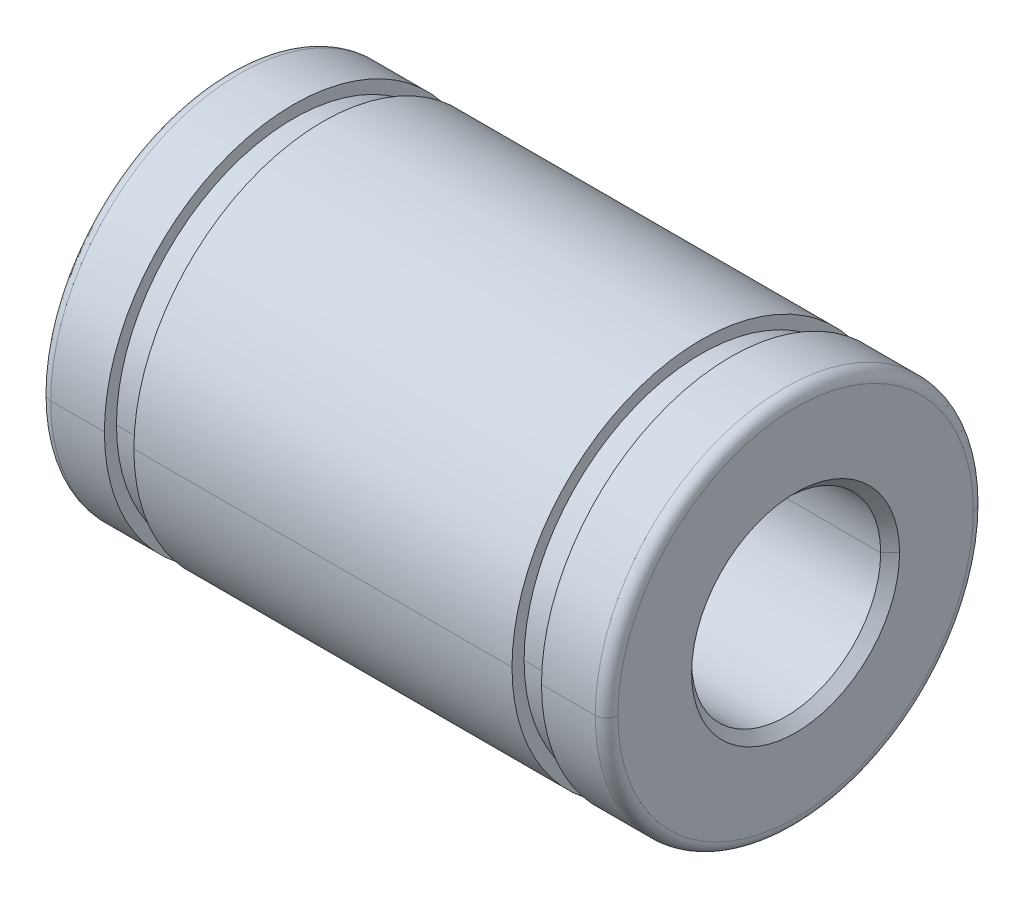
ISO-10303-21;
HEADER;
FILE_DESCRIPTION(('STEP AP214'),'2;1');
FILE_NAME('part.step','',(''),(''),'','','');
FILE_SCHEMA(('AUTOMOTIVE_DESIGN { 1 0 10303 214 1 1 1 1 }'));
ENDSEC;
DATA;
#1=APPLICATION_CONTEXT('core data for automotive mechanical design processes');
#2=APPLICATION_PROTOCOL_DEFINITION('international standard','automotive_design',2000,#1);
#3=PRODUCT_CONTEXT('',#1,'mechanical');
#4=PRODUCT('Part','Part','',(#3));
#5=PRODUCT_RELATED_PRODUCT_CATEGORY('part','',(#4));
#6=PRODUCT_DEFINITION_FORMATION('','',#4);
#7=PRODUCT_DEFINITION_CONTEXT('part definition',#1,'design');
#8=PRODUCT_DEFINITION('design','',#6,#7);
#9=PRODUCT_DEFINITION_SHAPE('','',#8);
#10=(LENGTH_UNIT() NAMED_UNIT(*) SI_UNIT(.MILLI.,.METRE.));
#11=(NAMED_UNIT(*) PLANE_ANGLE_UNIT() SI_UNIT($,.RADIAN.));
#12=(NAMED_UNIT(*) SI_UNIT($,.STERADIAN.) SOLID_ANGLE_UNIT());
#13=UNCERTAINTY_MEASURE_WITH_UNIT(LENGTH_MEASURE(1.E-05),#10,'distance_accuracy_value','');
#14=(GEOMETRIC_REPRESENTATION_CONTEXT(3) GLOBAL_UNCERTAINTY_ASSIGNED_CONTEXT((#13)) GLOBAL_UNIT_ASSIGNED_CONTEXT((#10,
#11,#12)) REPRESENTATION_CONTEXT('',''));
#15=CARTESIAN_POINT('',(0.,0.,0.));
#16=DIRECTION('',(0.,0.,1.));
#17=DIRECTION('',(1.,0.,0.));
#18=AXIS2_PLACEMENT_3D('',#15,#16,#17);
#19=CARTESIAN_POINT('',(0.,5.969,0.));
#20=DIRECTION('',(-1.,0.,0.));
#21=DIRECTION('',(0.,0.,1.));
#22=AXIS2_PLACEMENT_3D('',#19,#20,#21);
#23=PLANE('',#22);
#24=CARTESIAN_POINT('',(0.,0.,0.));
#25=DIRECTION('',(1.,0.,0.));
#26=DIRECTION('',(0.,0.,-1.));
#27=AXIS2_PLACEMENT_3D('',#24,#25,#26);
#28=CIRCLE('',#27,3.4925);
#29=CARTESIAN_POINT('',(0.,0.,-3.4925));
#30=VERTEX_POINT('',#29);
#31=CARTESIAN_POINT('',(0.,0.,3.4925));
#32=VERTEX_POINT('',#31);
#33=EDGE_CURVE('E11',#30,#32,#28,.T.);
#34=ORIENTED_EDGE('',*,*,#33,.T.);
#35=CARTESIAN_POINT('',(0.,0.,0.));
#36=DIRECTION('',(1.,0.,0.));
#37=DIRECTION('',(0.,0.,-1.));
#38=AXIS2_PLACEMENT_3D('',#35,#36,#37);
#39=CIRCLE('',#38,3.4925);
#40=EDGE_CURVE('E25',#32,#30,#39,.T.);
#41=ORIENTED_EDGE('',*,*,#40,.T.);
#42=EDGE_LOOP('',(#34,#41));
#43=FACE_BOUND('',#42,.T.);
#44=CARTESIAN_POINT('',(0.,0.,0.));
#45=DIRECTION('',(1.,0.,0.));
#46=DIRECTION('',(0.,0.,-1.));
#47=AXIS2_PLACEMENT_3D('',#44,#45,#46);
#48=CIRCLE('',#47,5.969);
#49=CARTESIAN_POINT('',(0.,0.,-5.969));
#50=VERTEX_POINT('',#49);
#51=CARTESIAN_POINT('',(0.,0.,5.969));
#52=VERTEX_POINT('',#51);
#53=EDGE_CURVE('E468',#50,#52,#48,.T.);
#54=ORIENTED_EDGE('',*,*,#53,.F.);
#55=CARTESIAN_POINT('',(0.,0.,0.));
#56=DIRECTION('',(1.,0.,0.));
#57=DIRECTION('',(0.,0.,-1.));
#58=AXIS2_PLACEMENT_3D('',#55,#56,#57);
#59=CIRCLE('',#58,5.969);
#60=EDGE_CURVE('E466',#52,#50,#59,.T.);
#61=ORIENTED_EDGE('',*,*,#60,.F.);
#62=EDGE_LOOP('',(#54,#61));
#63=FACE_BOUND('',#62,.T.);
#64=ADVANCED_FACE('F17',(#43,#63),#23,.T.);
#65=CARTESIAN_POINT('',(0.380999999999964,0.,0.));
#66=DIRECTION('',(1.,0.,0.));
#67=DIRECTION('',(0.,1.,0.));
#68=AXIS2_PLACEMENT_3D('',#65,#66,#67);
#69=TOROIDAL_SURFACE('',#68,5.969,0.381);
#70=ORIENTED_EDGE('',*,*,#60,.T.);
#71=CARTESIAN_POINT('',(0.,0.,-5.969));
#72=CARTESIAN_POINT('',(-1.32240858758698E-07,0.,-5.9752341042174));
#73=CARTESIAN_POINT('',(0.000153003075281332,0.,-5.9814681971824));
#74=CARTESIAN_POINT('',(0.000764859296306252,0.,-5.99392137065509));
#75=CARTESIAN_POINT('',(0.0012235802011911,0.,-6.00014045116278));
#76=CARTESIAN_POINT('',(0.00244565807452358,0.,-6.01254860976834));
#77=CARTESIAN_POINT('',(0.00320901504297122,0.,-6.01873768786621));
#78=CARTESIAN_POINT('',(0.00503848436379427,0.,-6.03107093366877));
#79=CARTESIAN_POINT('',(0.00610459671616969,0.,-6.03721510137347));
#80=CARTESIAN_POINT('',(0.00853701961649716,0.,-6.04944372400281));
#81=CARTESIAN_POINT('',(0.0099033301644492,0.,-6.05552817892745));
#82=CARTESIAN_POINT('',(0.0129328549012367,0.,-6.06762271815884));
#83=CARTESIAN_POINT('',(0.0145960690900722,0.,-6.07363280246559));
#84=CARTESIAN_POINT('',(0.0182153950819128,0.,-6.08556412160231));
#85=CARTESIAN_POINT('',(0.0201715068849179,0.,-6.09148535643227));
#86=CARTESIAN_POINT('',(0.0243719154455482,0.,-6.1032247118526));
#87=CARTESIAN_POINT('',(0.0266162122031733,0.,-6.10904283244298));
#88=CARTESIAN_POINT('',(0.0313875840231542,0.,-6.12056194301922));
#89=CARTESIAN_POINT('',(0.0339146590855101,0.,-6.12626293300507));
#90=CARTESIAN_POINT('',(0.0392454995543539,0.,-6.1375340481888));
#91=CARTESIAN_POINT('',(0.0420492649608419,0.,-6.14310417338667));
#92=CARTESIAN_POINT('',(0.0479267316056391,0.,-6.15410014007474));
#93=CARTESIAN_POINT('',(0.0510004328439482,0.,-6.15952598156493));
#94=CARTESIAN_POINT('',(0.0574103663357721,0.,-6.1702203095103));
#95=CARTESIAN_POINT('',(0.0607465985892869,0.,-6.17548879596548));
#96=CARTESIAN_POINT('',(0.067673556836101,0.,-6.18585572159546));
#97=CARTESIAN_POINT('',(0.0712642828294003,0.,-6.19095416077026));
#98=CARTESIAN_POINT('',(0.0786915781822755,0.,-6.20096870925297));
#99=CARTESIAN_POINT('',(0.0825281475418514,0.,-6.20588481856086));
#100=CARTESIAN_POINT('',(0.0904378869956701,0.,-6.21552286397183));
#101=CARTESIAN_POINT('',(0.0945110570899129,0.,-6.2202448000749));
#102=CARTESIAN_POINT('',(0.102884185389535,0.,-6.22948312351853));
#103=CARTESIAN_POINT('',(0.107184143594915,0.,-6.2339995108591));
#104=CARTESIAN_POINT('',(0.116000489140863,0.,-6.24281585640505));
#105=CARTESIAN_POINT('',(0.120516876481432,0.,-6.24711581461043));
#106=CARTESIAN_POINT('',(0.129755199925067,0.,-6.25548894291005));
#107=CARTESIAN_POINT('',(0.134477136028132,0.,-6.25956211300429));
#108=CARTESIAN_POINT('',(0.144115181439096,0.,-6.26747185245811));
#109=CARTESIAN_POINT('',(0.149031290746994,0.,-6.27130842181769));
#110=CARTESIAN_POINT('',(0.159045839229698,0.,-6.27873571717056));
#111=CARTESIAN_POINT('',(0.164144278404504,0.,-6.28232644316386));
#112=CARTESIAN_POINT('',(0.174511204034485,0.,-6.28925340141068));
#113=CARTESIAN_POINT('',(0.179779690489661,0.,-6.29258963366419));
#114=CARTESIAN_POINT('',(0.190474018435031,0.,-6.29899956715601));
#115=CARTESIAN_POINT('',(0.195899859925225,0.,-6.30207326839432));
#116=CARTESIAN_POINT('',(0.206895826613291,0.,-6.30795073503912));
#117=CARTESIAN_POINT('',(0.212465951811162,0.,-6.31075450044561));
#118=CARTESIAN_POINT('',(0.22373706699489,0.,-6.31608534091445));
#119=CARTESIAN_POINT('',(0.229438056980747,0.,-6.31861241597681));
#120=CARTESIAN_POINT('',(0.240957167556981,0.,-6.32338378779679));
#121=CARTESIAN_POINT('',(0.246775288147358,0.,-6.32562808455441));
#122=CARTESIAN_POINT('',(0.258514643567696,0.,-6.32982849311505));
#123=CARTESIAN_POINT('',(0.264435878397656,0.,-6.33178460491805));
#124=CARTESIAN_POINT('',(0.27636719753437,0.,-6.33540393090989));
#125=CARTESIAN_POINT('',(0.282377281841124,0.,-6.33706714509873));
#126=CARTESIAN_POINT('',(0.294471821072514,0.,-6.34009666983551));
#127=CARTESIAN_POINT('',(0.30055627599715,0.,-6.34146298038347));
#128=CARTESIAN_POINT('',(0.312784898626486,0.,-6.34389540328379));
#129=CARTESIAN_POINT('',(0.318929066331186,0.,-6.34496151563617));
#130=CARTESIAN_POINT('',(0.331262312133754,0.,-6.34679098495699));
#131=CARTESIAN_POINT('',(0.337451390231621,0.,-6.34755434192544));
#132=CARTESIAN_POINT('',(0.349859548837179,0.,-6.34877641979877));
#133=CARTESIAN_POINT('',(0.35607862934487,0.,-6.34923514070366));
#134=CARTESIAN_POINT('',(0.368531802817563,0.,-6.34984699692468));
#135=CARTESIAN_POINT('',(0.374765895782564,0.,-6.35000013224082));
#136=CARTESIAN_POINT('',(0.380999999999963,0.,-6.35));
#137=B_SPLINE_CURVE_WITH_KNOTS('',3,(#71,#72,#73,#74,#75,#76,#77,#78,#79,#80,#81,#82,#83,#84,
#85,#86,#87,#88,#89,#90,#91,#92,#93,#94,#95,#96,#97,#98,#99,#100,#101,#102,#103,#104,#105,#106,
#107,#108,#109,#110,#111,#112,#113,#114,#115,#116,#117,#118,#119,#120,#121,#122,#123,#124,#125,
#126,#127,#128,#129,#130,#131,#132,#133,#134,#135,#136),.UNSPECIFIED.,.F.,.F.,(4,2,2,2,2,2,2,2,
2,2,2,2,2,2,2,2,2,2,2,2,2,2,2,2,2,2,2,2,2,2,2,2,4),(0.,0.0187004161344584,0.0374008322689178,
0.056101248403377,0.0748016645378364,0.0935020806722951,0.112202496806755,0.130902912941214,
0.149603329075673,0.168303745210132,0.187004161344591,0.20570457747905,0.224404993613509,
0.243105409747968,0.261805825882428,0.280506242016887,0.299206658151346,0.317907074285805,
0.336607490420264,0.355307906554723,0.374008322689182,0.392708738823642,0.411409154958101,
0.43010957109256,0.448809987227019,0.467510403361478,0.486210819495937,0.504911235630396,
0.523611651764855,0.542312067899315,0.561012484033774,0.579712900168233,0.598413316302692),.UNSPECIFIED.);
#138=CARTESIAN_POINT('',(0.381,0.,-6.35));
#139=VERTEX_POINT('',#138);
#140=EDGE_CURVE('E434',#50,#139,#137,.T.);
#141=ORIENTED_EDGE('',*,*,#140,.T.);
#142=CARTESIAN_POINT('',(0.381,0.,0.));
#143=DIRECTION('',(1.,0.,0.));
#144=DIRECTION('',(0.,0.,-1.));
#145=AXIS2_PLACEMENT_3D('',#142,#143,#144);
#146=CIRCLE('',#145,6.35);
#147=CARTESIAN_POINT('',(0.381,0.,6.35));
#148=VERTEX_POINT('',#147);
#149=EDGE_CURVE('E452',#148,#139,#146,.T.);
#150=ORIENTED_EDGE('',*,*,#149,.F.);
#151=CARTESIAN_POINT('',(0.,0.,5.969));
#152=CARTESIAN_POINT('',(-1.32240858775832E-07,0.,5.9752341042174));
#153=CARTESIAN_POINT('',(0.000153003075281312,0.,5.9814681971824));
#154=CARTESIAN_POINT('',(0.000764859296306258,0.,5.99392137065509));
#155=CARTESIAN_POINT('',(0.00122358020119112,0.,6.00014045116278));
#156=CARTESIAN_POINT('',(0.00244565807452364,0.,6.01254860976834));
#157=CARTESIAN_POINT('',(0.00320901504297128,0.,6.01873768786621));
#158=CARTESIAN_POINT('',(0.00503848436379435,0.,6.03107093366877));
#159=CARTESIAN_POINT('',(0.00610459671616979,0.,6.03721510137347));
#160=CARTESIAN_POINT('',(0.00853701961649722,0.,6.04944372400281));
#161=CARTESIAN_POINT('',(0.00990333016444922,0.,6.05552817892745));
#162=CARTESIAN_POINT('',(0.0129328549012367,0.,6.06762271815884));
#163=CARTESIAN_POINT('',(0.0145960690900723,0.,6.07363280246559));
#164=CARTESIAN_POINT('',(0.018215395081913,0.,6.08556412160231));
#165=CARTESIAN_POINT('',(0.0201715068849182,0.,6.09148535643227));
#166=CARTESIAN_POINT('',(0.0243719154455484,0.,6.1032247118526));
#167=CARTESIAN_POINT('',(0.0266162122031734,0.,6.10904283244298));
#168=CARTESIAN_POINT('',(0.0313875840231543,0.,6.12056194301922));
#169=CARTESIAN_POINT('',(0.0339146590855102,0.,6.12626293300507));
#170=CARTESIAN_POINT('',(0.0392454995543542,0.,6.1375340481888));
#171=CARTESIAN_POINT('',(0.0420492649608423,0.,6.14310417338667));
#172=CARTESIAN_POINT('',(0.0479267316056393,0.,6.15410014007474));
#173=CARTESIAN_POINT('',(0.0510004328439482,0.,6.15952598156493));
#174=CARTESIAN_POINT('',(0.0574103663357722,0.,6.1702203095103));
#175=CARTESIAN_POINT('',(0.0607465985892872,0.,6.17548879596548));
#176=CARTESIAN_POINT('',(0.0676735568361013,0.,6.18585572159546));
#177=CARTESIAN_POINT('',(0.0712642828294004,0.,6.19095416077026));
#178=CARTESIAN_POINT('',(0.0786915781822755,0.,6.20096870925297));
#179=CARTESIAN_POINT('',(0.0825281475418516,0.,6.20588481856087));
#180=CARTESIAN_POINT('',(0.0904378869956704,0.,6.21552286397183));
#181=CARTESIAN_POINT('',(0.0945110570899132,0.,6.2202448000749));
#182=CARTESIAN_POINT('',(0.102884185389535,0.,6.22948312351853));
#183=CARTESIAN_POINT('',(0.107184143594915,0.,6.2339995108591));
#184=CARTESIAN_POINT('',(0.116000489140863,0.,6.24281585640505));
#185=CARTESIAN_POINT('',(0.120516876481432,0.,6.24711581461043));
#186=CARTESIAN_POINT('',(0.129755199925067,0.,6.25548894291005));
#187=CARTESIAN_POINT('',(0.134477136028133,0.,6.25956211300429));
#188=CARTESIAN_POINT('',(0.144115181439096,0.,6.26747185245811));
#189=CARTESIAN_POINT('',(0.149031290746994,0.,6.27130842181769));
#190=CARTESIAN_POINT('',(0.159045839229698,0.,6.27873571717056));
#191=CARTESIAN_POINT('',(0.164144278404504,0.,6.28232644316386));
#192=CARTESIAN_POINT('',(0.174511204034486,0.,6.28925340141068));
#193=CARTESIAN_POINT('',(0.179779690489661,0.,6.29258963366419));
#194=CARTESIAN_POINT('',(0.190474018435031,0.,6.29899956715601));
#195=CARTESIAN_POINT('',(0.195899859925226,0.,6.30207326839432));
#196=CARTESIAN_POINT('',(0.206895826613291,0.,6.30795073503912));
#197=CARTESIAN_POINT('',(0.212465951811162,0.,6.31075450044561));
#198=CARTESIAN_POINT('',(0.22373706699489,0.,6.31608534091445));
#199=CARTESIAN_POINT('',(0.229438056980747,0.,6.31861241597681));
#200=CARTESIAN_POINT('',(0.240957167556981,0.,6.32338378779679));
#201=CARTESIAN_POINT('',(0.246775288147359,0.,6.32562808455441));
#202=CARTESIAN_POINT('',(0.258514643567696,0.,6.32982849311505));
#203=CARTESIAN_POINT('',(0.264435878397656,0.,6.33178460491805));
#204=CARTESIAN_POINT('',(0.27636719753437,0.,6.33540393090989));
#205=CARTESIAN_POINT('',(0.282377281841125,0.,6.33706714509873));
#206=CARTESIAN_POINT('',(0.294471821072515,0.,6.34009666983551));
#207=CARTESIAN_POINT('',(0.30055627599715,0.,6.34146298038347));
#208=CARTESIAN_POINT('',(0.312784898626486,0.,6.34389540328379));
#209=CARTESIAN_POINT('',(0.318929066331186,0.,6.34496151563617));
#210=CARTESIAN_POINT('',(0.331262312133754,0.,6.34679098495699));
#211=CARTESIAN_POINT('',(0.337451390231621,0.,6.34755434192544));
#212=CARTESIAN_POINT('',(0.34985954883718,0.,6.34877641979877));
#213=CARTESIAN_POINT('',(0.356078629344871,0.,6.34923514070366));
#214=CARTESIAN_POINT('',(0.368531802817563,0.,6.34984699692468));
#215=CARTESIAN_POINT('',(0.374765895782564,0.,6.35000013224082));
#216=CARTESIAN_POINT('',(0.380999999999963,0.,6.35));
#217=B_SPLINE_CURVE_WITH_KNOTS('',3,(#151,#152,#153,#154,#155,#156,#157,#158,#159,#160,#161,
#162,#163,#164,#165,#166,#167,#168,#169,#170,#171,#172,#173,#174,#175,#176,#177,#178,#179,#180,
#181,#182,#183,#184,#185,#186,#187,#188,#189,#190,#191,#192,#193,#194,#195,#196,#197,#198,#199,
#200,#201,#202,#203,#204,#205,#206,#207,#208,#209,#210,#211,#212,#213,#214,#215,#216),
.UNSPECIFIED.,.F.,.F.,(4,2,2,2,2,2,2,2,2,2,2,2,2,2,2,2,2,2,2,2,2,2,2,2,2,2,2,2,2,2,2,2,4),(0.,
0.0187004161344593,0.0374008322689186,0.056101248403377,0.0748016645378364,0.093502080672296,
0.112202496806755,0.130902912941214,0.149603329075673,0.168303745210132,0.187004161344591,
0.205704577479051,0.224404993613509,0.243105409747969,0.261805825882428,0.280506242016887,
0.299206658151346,0.317907074285805,0.336607490420264,0.355307906554724,0.374008322689183,
0.392708738823642,0.411409154958101,0.43010957109256,0.448809987227019,0.467510403361479,
0.486210819495938,0.504911235630397,0.523611651764856,0.542312067899315,0.561012484033774,
0.579712900168233,0.598413316302692),.UNSPECIFIED.);
#218=EDGE_CURVE('E437',#52,#148,#217,.T.);
#219=ORIENTED_EDGE('',*,*,#218,.F.);
#220=EDGE_LOOP('',(#70,#141,#150,#219));
#221=FACE_BOUND('',#220,.T.);
#222=ADVANCED_FACE('F417',(#221),#69,.T.);
#223=CARTESIAN_POINT('',(0.380999999999964,0.,0.));
#224=DIRECTION('',(1.,0.,0.));
#225=DIRECTION('',(0.,-1.,0.));
#226=AXIS2_PLACEMENT_3D('',#223,#224,#225);
#227=TOROIDAL_SURFACE('',#226,5.969,0.381);
#228=CARTESIAN_POINT('',(0.381,0.,0.));
#229=DIRECTION('',(1.,0.,0.));
#230=DIRECTION('',(0.,0.,-1.));
#231=AXIS2_PLACEMENT_3D('',#228,#229,#230);
#232=CIRCLE('',#231,6.35);
#233=EDGE_CURVE('E398',#139,#148,#232,.T.);
#234=ORIENTED_EDGE('',*,*,#233,.F.);
#235=ORIENTED_EDGE('',*,*,#140,.F.);
#236=ORIENTED_EDGE('',*,*,#53,.T.);
#237=ORIENTED_EDGE('',*,*,#218,.T.);
#238=EDGE_LOOP('',(#234,#235,#236,#237));
#239=FACE_BOUND('',#238,.T.);
#240=ADVANCED_FACE('F407',(#239),#227,.T.);
#241=CARTESIAN_POINT('',(19.05,0.,0.));
#242=DIRECTION('',(-1.,0.,0.));
#243=DIRECTION('',(0.,-1.,0.));
#244=AXIS2_PLACEMENT_3D('',#241,#242,#243);
#245=CYLINDRICAL_SURFACE('',#244,6.35);
#246=CARTESIAN_POINT('',(2.1844,0.,0.));
#247=DIRECTION('',(1.,0.,0.));
#248=DIRECTION('',(0.,0.,-1.));
#249=AXIS2_PLACEMENT_3D('',#246,#247,#248);
#250=CIRCLE('',#249,6.35);
#251=CARTESIAN_POINT('',(2.1844,0.,-6.35));
#252=VERTEX_POINT('',#251);
#253=CARTESIAN_POINT('',(2.1844,0.,6.35));
#254=VERTEX_POINT('',#253);
#255=EDGE_CURVE('E393',#252,#254,#250,.T.);
#256=ORIENTED_EDGE('',*,*,#255,.F.);
#257=DIRECTION('',(-1.,0.,0.));
#258=VECTOR('',#257,1.);
#259=CARTESIAN_POINT('',(2.1844,0.,-6.35));
#260=LINE('',#259,#258);
#261=EDGE_CURVE('E388',#252,#139,#260,.T.);
#262=ORIENTED_EDGE('',*,*,#261,.T.);
#263=ORIENTED_EDGE('',*,*,#233,.T.);
#264=DIRECTION('',(-1.,0.,0.));
#265=VECTOR('',#264,1.);
#266=CARTESIAN_POINT('',(2.1844,0.,6.35));
#267=LINE('',#266,#265);
#268=EDGE_CURVE('E383',#254,#148,#267,.T.);
#269=ORIENTED_EDGE('',*,*,#268,.F.);
#270=EDGE_LOOP('',(#256,#262,#263,#269));
#271=FACE_BOUND('',#270,.T.);
#272=ADVANCED_FACE('F416',(#271),#245,.T.);
#273=CARTESIAN_POINT('',(19.05,0.,0.));
#274=DIRECTION('',(-1.,0.,0.));
#275=DIRECTION('',(0.,1.,0.));
#276=AXIS2_PLACEMENT_3D('',#273,#274,#275);
#277=CYLINDRICAL_SURFACE('',#276,6.35);
#278=ORIENTED_EDGE('',*,*,#149,.T.);
#279=ORIENTED_EDGE('',*,*,#261,.F.);
#280=CARTESIAN_POINT('',(2.1844,0.,0.));
#281=DIRECTION('',(1.,0.,0.));
#282=DIRECTION('',(0.,0.,-1.));
#283=AXIS2_PLACEMENT_3D('',#280,#281,#282);
#284=CIRCLE('',#283,6.35);
#285=EDGE_CURVE('E378',#254,#252,#284,.T.);
#286=ORIENTED_EDGE('',*,*,#285,.F.);
#287=ORIENTED_EDGE('',*,*,#268,.T.);
#288=EDGE_LOOP('',(#278,#279,#286,#287));
#289=FACE_BOUND('',#288,.T.);
#290=ADVANCED_FACE('F507',(#289),#277,.T.);
#291=CARTESIAN_POINT('',(2.1844,5.9436,0.));
#292=DIRECTION('',(1.,0.,0.));
#293=DIRECTION('',(0.,0.,-1.));
#294=AXIS2_PLACEMENT_3D('',#291,#292,#293);
#295=PLANE('',#294);
#296=ORIENTED_EDGE('',*,*,#255,.T.);
#297=ORIENTED_EDGE('',*,*,#285,.T.);
#298=EDGE_LOOP('',(#296,#297));
#299=FACE_BOUND('',#298,.T.);
#300=CARTESIAN_POINT('',(2.1844,0.,0.));
#301=DIRECTION('',(1.,0.,0.));
#302=DIRECTION('',(0.,0.,-1.));
#303=AXIS2_PLACEMENT_3D('',#300,#301,#302);
#304=CIRCLE('',#303,5.9436);
#305=CARTESIAN_POINT('',(2.1844,0.,-5.9436));
#306=VERTEX_POINT('',#305);
#307=CARTESIAN_POINT('',(2.1844,0.,5.9436));
#308=VERTEX_POINT('',#307);
#309=EDGE_CURVE('E373',#306,#308,#304,.T.);
#310=ORIENTED_EDGE('',*,*,#309,.F.);
#311=CARTESIAN_POINT('',(2.1844,0.,0.));
#312=DIRECTION('',(1.,0.,0.));
#313=DIRECTION('',(0.,0.,-1.));
#314=AXIS2_PLACEMENT_3D('',#311,#312,#313);
#315=CIRCLE('',#314,5.9436);
#316=EDGE_CURVE('E368',#308,#306,#315,.T.);
#317=ORIENTED_EDGE('',*,*,#316,.F.);
#318=EDGE_LOOP('',(#310,#317));
#319=FACE_BOUND('',#318,.T.);
#320=ADVANCED_FACE('F516',(#299,#319),#295,.T.);
#321=CARTESIAN_POINT('',(19.05,0.,0.));
#322=DIRECTION('',(-1.,0.,0.));
#323=DIRECTION('',(0.,1.,0.));
#324=AXIS2_PLACEMENT_3D('',#321,#322,#323);
#325=CYLINDRICAL_SURFACE('',#324,5.9436);
#326=ORIENTED_EDGE('',*,*,#316,.T.);
#327=DIRECTION('',(-1.,0.,0.));
#328=VECTOR('',#327,1.);
#329=CARTESIAN_POINT('',(3.175,0.,-5.9436));
#330=LINE('',#329,#328);
#331=CARTESIAN_POINT('',(3.175,0.,-5.9436));
#332=VERTEX_POINT('',#331);
#333=EDGE_CURVE('E363',#332,#306,#330,.T.);
#334=ORIENTED_EDGE('',*,*,#333,.F.);
#335=CARTESIAN_POINT('',(3.175,0.,0.));
#336=DIRECTION('',(1.,0.,0.));
#337=DIRECTION('',(0.,0.,-1.));
#338=AXIS2_PLACEMENT_3D('',#335,#336,#337);
#339=CIRCLE('',#338,5.9436);
#340=CARTESIAN_POINT('',(3.175,0.,5.9436));
#341=VERTEX_POINT('',#340);
#342=EDGE_CURVE('E358',#341,#332,#339,.T.);
#343=ORIENTED_EDGE('',*,*,#342,.F.);
#344=DIRECTION('',(-1.,0.,0.));
#345=VECTOR('',#344,1.);
#346=CARTESIAN_POINT('',(3.175,0.,5.9436));
#347=LINE('',#346,#345);
#348=EDGE_CURVE('E353',#341,#308,#347,.T.);
#349=ORIENTED_EDGE('',*,*,#348,.T.);
#350=EDGE_LOOP('',(#326,#334,#343,#349));
#351=FACE_BOUND('',#350,.T.);
#352=ADVANCED_FACE('F525',(#351),#325,.T.);
#353=CARTESIAN_POINT('',(19.05,0.,0.));
#354=DIRECTION('',(-1.,0.,0.));
#355=DIRECTION('',(0.,-1.,0.));
#356=AXIS2_PLACEMENT_3D('',#353,#354,#355);
#357=CYLINDRICAL_SURFACE('',#356,5.9436);
#358=CARTESIAN_POINT('',(3.175,0.,0.));
#359=DIRECTION('',(1.,0.,0.));
#360=DIRECTION('',(0.,0.,-1.));
#361=AXIS2_PLACEMENT_3D('',#358,#359,#360);
#362=CIRCLE('',#361,5.9436);
#363=EDGE_CURVE('E348',#332,#341,#362,.T.);
#364=ORIENTED_EDGE('',*,*,#363,.F.);
#365=ORIENTED_EDGE('',*,*,#333,.T.);
#366=ORIENTED_EDGE('',*,*,#309,.T.);
#367=ORIENTED_EDGE('',*,*,#348,.F.);
#368=EDGE_LOOP('',(#364,#365,#366,#367));
#369=FACE_BOUND('',#368,.T.);
#370=ADVANCED_FACE('F535',(#369),#357,.T.);
#371=CARTESIAN_POINT('',(3.175,6.35,0.));
#372=DIRECTION('',(-1.,0.,0.));
#373=DIRECTION('',(0.,0.,1.));
#374=AXIS2_PLACEMENT_3D('',#371,#372,#373);
#375=PLANE('',#374);
#376=ORIENTED_EDGE('',*,*,#363,.T.);
#377=ORIENTED_EDGE('',*,*,#342,.T.);
#378=EDGE_LOOP('',(#376,#377));
#379=FACE_BOUND('',#378,.T.);
#380=CARTESIAN_POINT('',(3.175,0.,0.));
#381=DIRECTION('',(1.,0.,0.));
#382=DIRECTION('',(0.,0.,-1.));
#383=AXIS2_PLACEMENT_3D('',#380,#381,#382);
#384=CIRCLE('',#383,6.35);
#385=CARTESIAN_POINT('',(3.175,0.,-6.35));
#386=VERTEX_POINT('',#385);
#387=CARTESIAN_POINT('',(3.175,0.,6.35));
#388=VERTEX_POINT('',#387);
#389=EDGE_CURVE('E343',#386,#388,#384,.T.);
#390=ORIENTED_EDGE('',*,*,#389,.F.);
#391=CARTESIAN_POINT('',(3.175,0.,0.));
#392=DIRECTION('',(1.,0.,0.));
#393=DIRECTION('',(0.,0.,-1.));
#394=AXIS2_PLACEMENT_3D('',#391,#392,#393);
#395=CIRCLE('',#394,6.35);
#396=EDGE_CURVE('E338',#388,#386,#395,.T.);
#397=ORIENTED_EDGE('',*,*,#396,.F.);
#398=EDGE_LOOP('',(#390,#397));
#399=FACE_BOUND('',#398,.T.);
#400=ADVANCED_FACE('F545',(#379,#399),#375,.T.);
#401=CARTESIAN_POINT('',(19.05,0.,0.));
#402=DIRECTION('',(-1.,0.,0.));
#403=DIRECTION('',(0.,1.,0.));
#404=AXIS2_PLACEMENT_3D('',#401,#402,#403);
#405=CYLINDRICAL_SURFACE('',#404,6.35);
#406=ORIENTED_EDGE('',*,*,#396,.T.);
#407=DIRECTION('',(-1.,0.,0.));
#408=VECTOR('',#407,1.);
#409=CARTESIAN_POINT('',(15.875,0.,-6.35));
#410=LINE('',#409,#408);
#411=CARTESIAN_POINT('',(15.875,0.,-6.35));
#412=VERTEX_POINT('',#411);
#413=EDGE_CURVE('E333',#412,#386,#410,.T.);
#414=ORIENTED_EDGE('',*,*,#413,.F.);
#415=CARTESIAN_POINT('',(15.875,0.,0.));
#416=DIRECTION('',(1.,0.,0.));
#417=DIRECTION('',(0.,0.,-1.));
#418=AXIS2_PLACEMENT_3D('',#415,#416,#417);
#419=CIRCLE('',#418,6.35);
#420=CARTESIAN_POINT('',(15.875,0.,6.35));
#421=VERTEX_POINT('',#420);
#422=EDGE_CURVE('E328',#421,#412,#419,.T.);
#423=ORIENTED_EDGE('',*,*,#422,.F.);
#424=DIRECTION('',(-1.,0.,0.));
#425=VECTOR('',#424,1.);
#426=CARTESIAN_POINT('',(15.875,0.,6.35));
#427=LINE('',#426,#425);
#428=EDGE_CURVE('E323',#421,#388,#427,.T.);
#429=ORIENTED_EDGE('',*,*,#428,.T.);
#430=EDGE_LOOP('',(#406,#414,#423,#429));
#431=FACE_BOUND('',#430,.T.);
#432=ADVANCED_FACE('F555',(#431),#405,.T.);
#433=CARTESIAN_POINT('',(19.05,0.,0.));
#434=DIRECTION('',(-1.,0.,0.));
#435=DIRECTION('',(0.,-1.,0.));
#436=AXIS2_PLACEMENT_3D('',#433,#434,#435);
#437=CYLINDRICAL_SURFACE('',#436,6.35);
#438=CARTESIAN_POINT('',(15.875,0.,0.));
#439=DIRECTION('',(1.,0.,0.));
#440=DIRECTION('',(0.,0.,-1.));
#441=AXIS2_PLACEMENT_3D('',#438,#439,#440);
#442=CIRCLE('',#441,6.35);
#443=EDGE_CURVE('E318',#412,#421,#442,.T.);
#444=ORIENTED_EDGE('',*,*,#443,.F.);
#445=ORIENTED_EDGE('',*,*,#413,.T.);
#446=ORIENTED_EDGE('',*,*,#389,.T.);
#447=ORIENTED_EDGE('',*,*,#428,.F.);
#448=EDGE_LOOP('',(#444,#445,#446,#447));
#449=FACE_BOUND('',#448,.T.);
#450=ADVANCED_FACE('F565',(#449),#437,.T.);
#451=CARTESIAN_POINT('',(15.875,5.9436,0.));
#452=DIRECTION('',(1.,0.,0.));
#453=DIRECTION('',(0.,0.,-1.));
#454=AXIS2_PLACEMENT_3D('',#451,#452,#453);
#455=PLANE('',#454);
#456=ORIENTED_EDGE('',*,*,#443,.T.);
#457=ORIENTED_EDGE('',*,*,#422,.T.);
#458=EDGE_LOOP('',(#456,#457));
#459=FACE_BOUND('',#458,.T.);
#460=CARTESIAN_POINT('',(15.875,0.,0.));
#461=DIRECTION('',(1.,0.,0.));
#462=DIRECTION('',(0.,0.,-1.));
#463=AXIS2_PLACEMENT_3D('',#460,#461,#462);
#464=CIRCLE('',#463,5.9436);
#465=CARTESIAN_POINT('',(15.875,0.,-5.9436));
#466=VERTEX_POINT('',#465);
#467=CARTESIAN_POINT('',(15.875,0.,5.9436));
#468=VERTEX_POINT('',#467);
#469=EDGE_CURVE('E313',#466,#468,#464,.T.);
#470=ORIENTED_EDGE('',*,*,#469,.F.);
#471=CARTESIAN_POINT('',(15.875,0.,0.));
#472=DIRECTION('',(1.,0.,0.));
#473=DIRECTION('',(0.,0.,-1.));
#474=AXIS2_PLACEMENT_3D('',#471,#472,#473);
#475=CIRCLE('',#474,5.9436);
#476=EDGE_CURVE('E308',#468,#466,#475,.T.);
#477=ORIENTED_EDGE('',*,*,#476,.F.);
#478=EDGE_LOOP('',(#470,#477));
#479=FACE_BOUND('',#478,.T.);
#480=ADVANCED_FACE('F575',(#459,#479),#455,.T.);
#481=CARTESIAN_POINT('',(19.05,0.,0.));
#482=DIRECTION('',(-1.,0.,0.));
#483=DIRECTION('',(0.,1.,0.));
#484=AXIS2_PLACEMENT_3D('',#481,#482,#483);
#485=CYLINDRICAL_SURFACE('',#484,5.9436);
#486=ORIENTED_EDGE('',*,*,#476,.T.);
#487=DIRECTION('',(-1.,0.,0.));
#488=VECTOR('',#487,1.);
#489=CARTESIAN_POINT('',(16.8656,0.,-5.9436));
#490=LINE('',#489,#488);
#491=CARTESIAN_POINT('',(16.8656,0.,-5.9436));
#492=VERTEX_POINT('',#491);
#493=EDGE_CURVE('E303',#492,#466,#490,.T.);
#494=ORIENTED_EDGE('',*,*,#493,.F.);
#495=CARTESIAN_POINT('',(16.8656,0.,0.));
#496=DIRECTION('',(1.,0.,0.));
#497=DIRECTION('',(0.,0.,-1.));
#498=AXIS2_PLACEMENT_3D('',#495,#496,#497);
#499=CIRCLE('',#498,5.9436);
#500=CARTESIAN_POINT('',(16.8656,0.,5.9436));
#501=VERTEX_POINT('',#500);
#502=EDGE_CURVE('E298',#501,#492,#499,.T.);
#503=ORIENTED_EDGE('',*,*,#502,.F.);
#504=DIRECTION('',(-1.,0.,0.));
#505=VECTOR('',#504,1.);
#506=CARTESIAN_POINT('',(16.8656,0.,5.9436));
#507=LINE('',#506,#505);
#508=EDGE_CURVE('E293',#501,#468,#507,.T.);
#509=ORIENTED_EDGE('',*,*,#508,.T.);
#510=EDGE_LOOP('',(#486,#494,#503,#509));
#511=FACE_BOUND('',#510,.T.);
#512=ADVANCED_FACE('F585',(#511),#485,.T.);
#513=CARTESIAN_POINT('',(19.05,0.,0.));
#514=DIRECTION('',(-1.,0.,0.));
#515=DIRECTION('',(0.,-1.,0.));
#516=AXIS2_PLACEMENT_3D('',#513,#514,#515);
#517=CYLINDRICAL_SURFACE('',#516,5.9436);
#518=CARTESIAN_POINT('',(16.8656,0.,0.));
#519=DIRECTION('',(1.,0.,0.));
#520=DIRECTION('',(0.,0.,-1.));
#521=AXIS2_PLACEMENT_3D('',#518,#519,#520);
#522=CIRCLE('',#521,5.9436);
#523=EDGE_CURVE('E288',#492,#501,#522,.T.);
#524=ORIENTED_EDGE('',*,*,#523,.F.);
#525=ORIENTED_EDGE('',*,*,#493,.T.);
#526=ORIENTED_EDGE('',*,*,#469,.T.);
#527=ORIENTED_EDGE('',*,*,#508,.F.);
#528=EDGE_LOOP('',(#524,#525,#526,#527));
#529=FACE_BOUND('',#528,.T.);
#530=ADVANCED_FACE('F595',(#529),#517,.T.);
#531=CARTESIAN_POINT('',(16.8656,6.35,0.));
#532=DIRECTION('',(-1.,0.,0.));
#533=DIRECTION('',(0.,0.,1.));
#534=AXIS2_PLACEMENT_3D('',#531,#532,#533);
#535=PLANE('',#534);
#536=ORIENTED_EDGE('',*,*,#523,.T.);
#537=ORIENTED_EDGE('',*,*,#502,.T.);
#538=EDGE_LOOP('',(#536,#537));
#539=FACE_BOUND('',#538,.T.);
#540=CARTESIAN_POINT('',(16.8656,0.,0.));
#541=DIRECTION('',(1.,0.,0.));
#542=DIRECTION('',(0.,0.,-1.));
#543=AXIS2_PLACEMENT_3D('',#540,#541,#542);
#544=CIRCLE('',#543,6.35);
#545=CARTESIAN_POINT('',(16.8656,0.,-6.35));
#546=VERTEX_POINT('',#545);
#547=CARTESIAN_POINT('',(16.8656,0.,6.35));
#548=VERTEX_POINT('',#547);
#549=EDGE_CURVE('E283',#546,#548,#544,.T.);
#550=ORIENTED_EDGE('',*,*,#549,.F.);
#551=CARTESIAN_POINT('',(16.8656,0.,0.));
#552=DIRECTION('',(1.,0.,0.));
#553=DIRECTION('',(0.,0.,-1.));
#554=AXIS2_PLACEMENT_3D('',#551,#552,#553);
#555=CIRCLE('',#554,6.35);
#556=EDGE_CURVE('E278',#548,#546,#555,.T.);
#557=ORIENTED_EDGE('',*,*,#556,.F.);
#558=EDGE_LOOP('',(#550,#557));
#559=FACE_BOUND('',#558,.T.);
#560=ADVANCED_FACE('F605',(#539,#559),#535,.T.);
#561=CARTESIAN_POINT('',(19.05,0.,0.));
#562=DIRECTION('',(-1.,0.,0.));
#563=DIRECTION('',(0.,1.,0.));
#564=AXIS2_PLACEMENT_3D('',#561,#562,#563);
#565=CYLINDRICAL_SURFACE('',#564,6.35);
#566=ORIENTED_EDGE('',*,*,#556,.T.);
#567=DIRECTION('',(-1.,0.,0.));
#568=VECTOR('',#567,1.);
#569=CARTESIAN_POINT('',(18.669,0.,-6.35));
#570=LINE('',#569,#568);
#571=CARTESIAN_POINT('',(18.669,0.,-6.35));
#572=VERTEX_POINT('',#571);
#573=EDGE_CURVE('E273',#572,#546,#570,.T.);
#574=ORIENTED_EDGE('',*,*,#573,.F.);
#575=CARTESIAN_POINT('',(18.669,0.,0.));
#576=DIRECTION('',(1.,0.,0.));
#577=DIRECTION('',(0.,0.,-1.));
#578=AXIS2_PLACEMENT_3D('',#575,#576,#577);
#579=CIRCLE('',#578,6.35);
#580=CARTESIAN_POINT('',(18.6689999999999,0.,6.35));
#581=VERTEX_POINT('',#580);
#582=EDGE_CURVE('E269',#581,#572,#579,.T.);
#583=ORIENTED_EDGE('',*,*,#582,.F.);
#584=DIRECTION('',(-1.,0.,0.));
#585=VECTOR('',#584,1.);
#586=CARTESIAN_POINT('',(18.669,0.,6.35));
#587=LINE('',#586,#585);
#588=EDGE_CURVE('E264',#581,#548,#587,.T.);
#589=ORIENTED_EDGE('',*,*,#588,.T.);
#590=EDGE_LOOP('',(#566,#574,#583,#589));
#591=FACE_BOUND('',#590,.T.);
#592=ADVANCED_FACE('F615',(#591),#565,.T.);
#593=CARTESIAN_POINT('',(19.05,0.,0.));
#594=DIRECTION('',(-1.,0.,0.));
#595=DIRECTION('',(0.,-1.,0.));
#596=AXIS2_PLACEMENT_3D('',#593,#594,#595);
#597=CYLINDRICAL_SURFACE('',#596,6.35);
#598=CARTESIAN_POINT('',(18.669,0.,0.));
#599=DIRECTION('',(1.,0.,0.));
#600=DIRECTION('',(0.,0.,-1.));
#601=AXIS2_PLACEMENT_3D('',#598,#599,#600);
#602=CIRCLE('',#601,6.35);
#603=EDGE_CURVE('E260',#572,#581,#602,.T.);
#604=ORIENTED_EDGE('',*,*,#603,.F.);
#605=ORIENTED_EDGE('',*,*,#573,.T.);
#606=ORIENTED_EDGE('',*,*,#549,.T.);
#607=ORIENTED_EDGE('',*,*,#588,.F.);
#608=EDGE_LOOP('',(#604,#605,#606,#607));
#609=FACE_BOUND('',#608,.T.);
#610=ADVANCED_FACE('F625',(#609),#597,.T.);
#611=CARTESIAN_POINT('',(18.6689999999999,0.,0.));
#612=DIRECTION('',(1.,0.,0.));
#613=DIRECTION('',(0.,-1.,0.));
#614=AXIS2_PLACEMENT_3D('',#611,#612,#613);
#615=TOROIDAL_SURFACE('',#614,5.969,0.381);
#616=CARTESIAN_POINT('',(19.05,0.,0.));
#617=DIRECTION('',(1.,0.,0.));
#618=DIRECTION('',(0.,0.,-1.));
#619=AXIS2_PLACEMENT_3D('',#616,#617,#618);
#620=CIRCLE('',#619,5.969);
#621=CARTESIAN_POINT('',(19.05,0.,-5.969));
#622=VERTEX_POINT('',#621);
#623=CARTESIAN_POINT('',(19.0499999999999,0.,5.969));
#624=VERTEX_POINT('',#623);
#625=EDGE_CURVE('E257',#622,#624,#620,.T.);
#626=ORIENTED_EDGE('',*,*,#625,.F.);
#627=CARTESIAN_POINT('',(18.6689999999999,0.,-6.35));
#628=CARTESIAN_POINT('',(18.6752341042173,0.,-6.35000013224082));
#629=CARTESIAN_POINT('',(18.6814681971823,0.,-6.34984699692468));
#630=CARTESIAN_POINT('',(18.693921370655,0.,-6.34923514070366));
#631=CARTESIAN_POINT('',(18.7001404511627,0.,-6.34877641979877));
#632=CARTESIAN_POINT('',(18.7125486097683,0.,-6.34755434192544));
#633=CARTESIAN_POINT('',(18.7187376878661,0.,-6.34679098495699));
#634=CARTESIAN_POINT('',(18.7310709336687,0.,-6.34496151563617));
#635=CARTESIAN_POINT('',(18.7372151013734,0.,-6.34389540328379));
#636=CARTESIAN_POINT('',(18.7494437240027,0.,-6.34146298038347));
#637=CARTESIAN_POINT('',(18.7555281789274,0.,-6.34009666983552));
#638=CARTESIAN_POINT('',(18.7676227181588,0.,-6.33706714509873));
#639=CARTESIAN_POINT('',(18.7736328024655,0.,-6.33540393090989));
#640=CARTESIAN_POINT('',(18.7855641216022,0.,-6.33178460491805));
#641=CARTESIAN_POINT('',(18.7914853564322,0.,-6.32982849311505));
#642=CARTESIAN_POINT('',(18.8032247118525,0.,-6.32562808455442));
#643=CARTESIAN_POINT('',(18.8090428324429,0.,-6.32338378779679));
#644=CARTESIAN_POINT('',(18.8205619430191,0.,-6.31861241597681));
#645=CARTESIAN_POINT('',(18.826262933005,0.,-6.31608534091445));
#646=CARTESIAN_POINT('',(18.8375340481887,0.,-6.31075450044561));
#647=CARTESIAN_POINT('',(18.8431041733866,0.,-6.30795073503912));
#648=CARTESIAN_POINT('',(18.8541001400747,0.,-6.30207326839432));
#649=CARTESIAN_POINT('',(18.8595259815649,0.,-6.29899956715602));
#650=CARTESIAN_POINT('',(18.8702203095102,0.,-6.29258963366419));
#651=CARTESIAN_POINT('',(18.8754887959654,0.,-6.28925340141068));
#652=CARTESIAN_POINT('',(18.8858557215954,0.,-6.28232644316386));
#653=CARTESIAN_POINT('',(18.8909541607702,0.,-6.27873571717056));
#654=CARTESIAN_POINT('',(18.9009687092529,0.,-6.27130842181769));
#655=CARTESIAN_POINT('',(18.9058848185608,0.,-6.26747185245811));
#656=CARTESIAN_POINT('',(18.9155228639718,0.,-6.25956211300429));
#657=CARTESIAN_POINT('',(18.9202448000748,0.,-6.25548894291005));
#658=CARTESIAN_POINT('',(18.9294831235185,0.,-6.24711581461043));
#659=CARTESIAN_POINT('',(18.933999510859,0.,-6.24281585640505));
#660=CARTESIAN_POINT('',(18.942815856405,0.,-6.2339995108591));
#661=CARTESIAN_POINT('',(18.9471158146104,0.,-6.22948312351853));
#662=CARTESIAN_POINT('',(18.95548894291,0.,-6.2202448000749));
#663=CARTESIAN_POINT('',(18.9595621130042,0.,-6.21552286397183));
#664=CARTESIAN_POINT('',(18.967471852458,0.,-6.20588481856087));
#665=CARTESIAN_POINT('',(18.9713084218176,0.,-6.20096870925297));
#666=CARTESIAN_POINT('',(18.9787357171705,0.,-6.19095416077026));
#667=CARTESIAN_POINT('',(18.9823264431638,0.,-6.18585572159546));
#668=CARTESIAN_POINT('',(18.9892534014106,0.,-6.17548879596548));
#669=CARTESIAN_POINT('',(18.9925896336641,0.,-6.1702203095103));
#670=CARTESIAN_POINT('',(18.9989995671559,0.,-6.15952598156493));
#671=CARTESIAN_POINT('',(19.0020732683942,0.,-6.15410014007474));
#672=CARTESIAN_POINT('',(19.007950735039,0.,-6.14310417338667));
#673=CARTESIAN_POINT('',(19.0107545004455,0.,-6.1375340481888));
#674=CARTESIAN_POINT('',(19.0160853409144,0.,-6.12626293300507));
#675=CARTESIAN_POINT('',(19.0186124159767,0.,-6.12056194301922));
#676=CARTESIAN_POINT('',(19.0233837877967,0.,-6.10904283244298));
#677=CARTESIAN_POINT('',(19.0256280845543,0.,-6.1032247118526));
#678=CARTESIAN_POINT('',(19.029828493115,0.,-6.09148535643227));
#679=CARTESIAN_POINT('',(19.031784604918,0.,-6.08556412160231));
#680=CARTESIAN_POINT('',(19.0354039309098,0.,-6.07363280246559));
#681=CARTESIAN_POINT('',(19.0370671450986,0.,-6.06762271815884));
#682=CARTESIAN_POINT('',(19.0400966698354,0.,-6.05552817892745));
#683=CARTESIAN_POINT('',(19.0414629803834,0.,-6.04944372400281));
#684=CARTESIAN_POINT('',(19.0438954032837,0.,-6.03721510137348));
#685=CARTESIAN_POINT('',(19.0449615156361,0.,-6.03107093366878));
#686=CARTESIAN_POINT('',(19.0467909849569,0.,-6.01873768786621));
#687=CARTESIAN_POINT('',(19.0475543419254,0.,-6.01254860976834));
#688=CARTESIAN_POINT('',(19.0487764197987,0.,-6.00014045116278));
#689=CARTESIAN_POINT('',(19.0492351407036,0.,-5.99392137065509));
#690=CARTESIAN_POINT('',(19.0498469969246,0.,-5.9814681971824));
#691=CARTESIAN_POINT('',(19.0500001322407,0.,-5.9752341042174));
#692=CARTESIAN_POINT('',(19.0499999999999,0.,-5.969));
#693=B_SPLINE_CURVE_WITH_KNOTS('',3,(#627,#628,#629,#630,#631,#632,#633,#634,#635,#636,#637,
#638,#639,#640,#641,#642,#643,#644,#645,#646,#647,#648,#649,#650,#651,#652,#653,#654,#655,#656,
#657,#658,#659,#660,#661,#662,#663,#664,#665,#666,#667,#668,#669,#670,#671,#672,#673,#674,#675,
#676,#677,#678,#679,#680,#681,#682,#683,#684,#685,#686,#687,#688,#689,#690,#691,#692),
.UNSPECIFIED.,.F.,.F.,(4,2,2,2,2,2,2,2,2,2,2,2,2,2,2,2,2,2,2,2,2,2,2,2,2,2,2,2,2,2,2,2,4),(0.,
0.0187004161344585,0.0374008322689177,0.0561012484033788,0.0748016645378373,0.0935020806722968,
0.112202496806754,0.130902912941214,0.149603329075672,0.168303745210131,0.187004161344592,
0.205704577479049,0.22440499361351,0.24310540974797,0.261805825882427,0.280506242016887,
0.299206658151346,0.317907074285806,0.336607490420265,0.355307906554724,0.374008322689182,
0.392708738823641,0.411409154958101,0.43010957109256,0.44880998722702,0.467510403361478,
0.486210819495937,0.504911235630397,0.523611651764855,0.542312067899315,0.561012484033774,
0.579712900168233,0.598413316302692),.UNSPECIFIED.);
#694=EDGE_CURVE('E234',#572,#622,#693,.T.);
#695=ORIENTED_EDGE('',*,*,#694,.F.);
#696=ORIENTED_EDGE('',*,*,#603,.T.);
#697=CARTESIAN_POINT('',(18.6689999999999,0.,6.35));
#698=CARTESIAN_POINT('',(18.6752341042173,0.,6.35000013224082));
#699=CARTESIAN_POINT('',(18.6814681971823,0.,6.34984699692468));
#700=CARTESIAN_POINT('',(18.693921370655,0.,6.34923514070366));
#701=CARTESIAN_POINT('',(18.7001404511627,0.,6.34877641979877));
#702=CARTESIAN_POINT('',(18.7125486097683,0.,6.34755434192544));
#703=CARTESIAN_POINT('',(18.7187376878661,0.,6.34679098495699));
#704=CARTESIAN_POINT('',(18.7310709336687,0.,6.34496151563617));
#705=CARTESIAN_POINT('',(18.7372151013734,0.,6.34389540328379));
#706=CARTESIAN_POINT('',(18.7494437240027,0.,6.34146298038347));
#707=CARTESIAN_POINT('',(18.7555281789274,0.,6.34009666983551));
#708=CARTESIAN_POINT('',(18.7676227181588,0.,6.33706714509873));
#709=CARTESIAN_POINT('',(18.7736328024655,0.,6.33540393090989));
#710=CARTESIAN_POINT('',(18.7855641216022,0.,6.33178460491805));
#711=CARTESIAN_POINT('',(18.7914853564322,0.,6.32982849311505));
#712=CARTESIAN_POINT('',(18.8032247118525,0.,6.32562808455442));
#713=CARTESIAN_POINT('',(18.8090428324429,0.,6.32338378779679));
#714=CARTESIAN_POINT('',(18.8205619430191,0.,6.31861241597681));
#715=CARTESIAN_POINT('',(18.826262933005,0.,6.31608534091445));
#716=CARTESIAN_POINT('',(18.8375340481887,0.,6.31075450044561));
#717=CARTESIAN_POINT('',(18.8431041733866,0.,6.30795073503912));
#718=CARTESIAN_POINT('',(18.8541001400747,0.,6.30207326839432));
#719=CARTESIAN_POINT('',(18.8595259815649,0.,6.29899956715602));
#720=CARTESIAN_POINT('',(18.8702203095102,0.,6.29258963366419));
#721=CARTESIAN_POINT('',(18.8754887959654,0.,6.28925340141068));
#722=CARTESIAN_POINT('',(18.8858557215954,0.,6.28232644316386));
#723=CARTESIAN_POINT('',(18.8909541607702,0.,6.27873571717056));
#724=CARTESIAN_POINT('',(18.9009687092529,0.,6.27130842181769));
#725=CARTESIAN_POINT('',(18.9058848185608,0.,6.26747185245811));
#726=CARTESIAN_POINT('',(18.9155228639718,0.,6.25956211300429));
#727=CARTESIAN_POINT('',(18.9202448000748,0.,6.25548894291005));
#728=CARTESIAN_POINT('',(18.9294831235185,0.,6.24711581461043));
#729=CARTESIAN_POINT('',(18.933999510859,0.,6.24281585640505));
#730=CARTESIAN_POINT('',(18.942815856405,0.,6.2339995108591));
#731=CARTESIAN_POINT('',(18.9471158146104,0.,6.22948312351853));
#732=CARTESIAN_POINT('',(18.95548894291,0.,6.2202448000749));
#733=CARTESIAN_POINT('',(18.9595621130042,0.,6.21552286397183));
#734=CARTESIAN_POINT('',(18.967471852458,0.,6.20588481856087));
#735=CARTESIAN_POINT('',(18.9713084218176,0.,6.20096870925297));
#736=CARTESIAN_POINT('',(18.9787357171705,0.,6.19095416077026));
#737=CARTESIAN_POINT('',(18.9823264431638,0.,6.18585572159546));
#738=CARTESIAN_POINT('',(18.9892534014106,0.,6.17548879596548));
#739=CARTESIAN_POINT('',(18.9925896336641,0.,6.1702203095103));
#740=CARTESIAN_POINT('',(18.9989995671559,0.,6.15952598156493));
#741=CARTESIAN_POINT('',(19.0020732683942,0.,6.15410014007474));
#742=CARTESIAN_POINT('',(19.007950735039,0.,6.14310417338667));
#743=CARTESIAN_POINT('',(19.0107545004455,0.,6.1375340481888));
#744=CARTESIAN_POINT('',(19.0160853409144,0.,6.12626293300507));
#745=CARTESIAN_POINT('',(19.0186124159767,0.,6.12056194301922));
#746=CARTESIAN_POINT('',(19.0233837877967,0.,6.10904283244298));
#747=CARTESIAN_POINT('',(19.0256280845543,0.,6.1032247118526));
#748=CARTESIAN_POINT('',(19.029828493115,0.,6.09148535643227));
#749=CARTESIAN_POINT('',(19.031784604918,0.,6.08556412160231));
#750=CARTESIAN_POINT('',(19.0354039309098,0.,6.07363280246559));
#751=CARTESIAN_POINT('',(19.0370671450986,0.,6.06762271815884));
#752=CARTESIAN_POINT('',(19.0400966698354,0.,6.05552817892745));
#753=CARTESIAN_POINT('',(19.0414629803834,0.,6.04944372400281));
#754=CARTESIAN_POINT('',(19.0438954032837,0.,6.03721510137348));
#755=CARTESIAN_POINT('',(19.0449615156361,0.,6.03107093366878));
#756=CARTESIAN_POINT('',(19.0467909849569,0.,6.01873768786621));
#757=CARTESIAN_POINT('',(19.0475543419254,0.,6.01254860976834));
#758=CARTESIAN_POINT('',(19.0487764197987,0.,6.00014045116278));
#759=CARTESIAN_POINT('',(19.0492351407036,0.,5.99392137065509));
#760=CARTESIAN_POINT('',(19.0498469969246,0.,5.9814681971824));
#761=CARTESIAN_POINT('',(19.0500001322407,0.,5.9752341042174));
#762=CARTESIAN_POINT('',(19.0499999999999,0.,5.969));
#763=B_SPLINE_CURVE_WITH_KNOTS('',3,(#697,#698,#699,#700,#701,#702,#703,#704,#705,#706,#707,
#708,#709,#710,#711,#712,#713,#714,#715,#716,#717,#718,#719,#720,#721,#722,#723,#724,#725,#726,
#727,#728,#729,#730,#731,#732,#733,#734,#735,#736,#737,#738,#739,#740,#741,#742,#743,#744,#745,
#746,#747,#748,#749,#750,#751,#752,#753,#754,#755,#756,#757,#758,#759,#760,#761,#762),
.UNSPECIFIED.,.F.,.F.,(4,2,2,2,2,2,2,2,2,2,2,2,2,2,2,2,2,2,2,2,2,2,2,2,2,2,2,2,2,2,2,2,4),(0.,
0.0187004161344585,0.0374008322689177,0.0561012484033788,0.0748016645378373,0.0935020806722968,
0.112202496806754,0.130902912941214,0.149603329075672,0.168303745210131,0.187004161344592,
0.205704577479049,0.22440499361351,0.24310540974797,0.261805825882427,0.280506242016887,
0.299206658151346,0.317907074285806,0.336607490420265,0.355307906554723,0.374008322689182,
0.392708738823641,0.411409154958101,0.43010957109256,0.44880998722702,0.467510403361478,
0.486210819495937,0.504911235630397,0.523611651764855,0.542312067899315,0.561012484033774,
0.579712900168233,0.598413316302692),.UNSPECIFIED.);
#764=EDGE_CURVE('E247',#581,#624,#763,.T.);
#765=ORIENTED_EDGE('',*,*,#764,.T.);
#766=EDGE_LOOP('',(#626,#695,#696,#765));
#767=FACE_BOUND('',#766,.T.);
#768=ADVANCED_FACE('F212',(#767),#615,.T.);
#769=CARTESIAN_POINT('',(18.6689999999999,0.,0.));
#770=DIRECTION('',(1.,0.,0.));
#771=DIRECTION('',(0.,1.,0.));
#772=AXIS2_PLACEMENT_3D('',#769,#770,#771);
#773=TOROIDAL_SURFACE('',#772,5.969,0.381);
#774=ORIENTED_EDGE('',*,*,#582,.T.);
#775=ORIENTED_EDGE('',*,*,#694,.T.);
#776=CARTESIAN_POINT('',(19.05,0.,0.));
#777=DIRECTION('',(1.,0.,0.));
#778=DIRECTION('',(0.,0.,-1.));
#779=AXIS2_PLACEMENT_3D('',#776,#777,#778);
#780=CIRCLE('',#779,5.969);
#781=EDGE_CURVE('E192',#624,#622,#780,.T.);
#782=ORIENTED_EDGE('',*,*,#781,.F.);
#783=ORIENTED_EDGE('',*,*,#764,.F.);
#784=EDGE_LOOP('',(#774,#775,#782,#783));
#785=FACE_BOUND('',#784,.T.);
#786=ADVANCED_FACE('F201',(#785),#773,.T.);
#787=CARTESIAN_POINT('',(19.05,3.4925,0.));
#788=DIRECTION('',(1.,0.,0.));
#789=DIRECTION('',(0.,0.,-1.));
#790=AXIS2_PLACEMENT_3D('',#787,#788,#789);
#791=PLANE('',#790);
#792=ORIENTED_EDGE('',*,*,#625,.T.);
#793=ORIENTED_EDGE('',*,*,#781,.T.);
#794=EDGE_LOOP('',(#792,#793));
#795=FACE_BOUND('',#794,.T.);
#796=CARTESIAN_POINT('',(19.05,0.,0.));
#797=DIRECTION('',(1.,0.,0.));
#798=DIRECTION('',(0.,0.,-1.));
#799=AXIS2_PLACEMENT_3D('',#796,#797,#798);
#800=CIRCLE('',#799,3.4925);
#801=CARTESIAN_POINT('',(19.05,0.,-3.4925));
#802=VERTEX_POINT('',#801);
#803=CARTESIAN_POINT('',(19.0499999999992,0.,3.49250000000081));
#804=VERTEX_POINT('',#803);
#805=EDGE_CURVE('E187',#802,#804,#800,.T.);
#806=ORIENTED_EDGE('',*,*,#805,.F.);
#807=CARTESIAN_POINT('',(19.05,0.,0.));
#808=DIRECTION('',(1.,0.,0.));
#809=DIRECTION('',(0.,0.,-1.));
#810=AXIS2_PLACEMENT_3D('',#807,#808,#809);
#811=CIRCLE('',#810,3.4925);
#812=EDGE_CURVE('E182',#804,#802,#811,.T.);
#813=ORIENTED_EDGE('',*,*,#812,.F.);
#814=EDGE_LOOP('',(#806,#813));
#815=FACE_BOUND('',#814,.T.);
#816=ADVANCED_FACE('F211',(#795,#815),#791,.T.);
#817=CARTESIAN_POINT('',(18.7325,0.,0.));
#818=DIRECTION('',(1.,0.,0.));
#819=DIRECTION('',(0.,1.,0.));
#820=AXIS2_PLACEMENT_3D('',#817,#818,#819);
#821=CONICAL_SURFACE('',#820,3.175,0.7853981634);
#822=CARTESIAN_POINT('',(18.7325,0.,0.));
#823=DIRECTION('',(1.,0.,0.));
#824=DIRECTION('',(0.,0.,-1.));
#825=AXIS2_PLACEMENT_3D('',#822,#823,#824);
#826=CIRCLE('',#825,3.175);
#827=CARTESIAN_POINT('',(18.7325,0.,3.175));
#828=VERTEX_POINT('',#827);
#829=CARTESIAN_POINT('',(18.7325,0.,-3.175));
#830=VERTEX_POINT('',#829);
#831=EDGE_CURVE('E143',#828,#830,#826,.T.);
#832=ORIENTED_EDGE('',*,*,#831,.F.);
#833=DIRECTION('',(0.707106781184748,0.,0.707106781188347));
#834=VECTOR('',#833,1.);
#835=CARTESIAN_POINT('',(18.7325,0.,3.175));
#836=LINE('',#835,#834);
#837=EDGE_CURVE('E174',#828,#804,#836,.T.);
#838=ORIENTED_EDGE('',*,*,#837,.T.);
#839=ORIENTED_EDGE('',*,*,#812,.T.);
#840=DIRECTION('',(0.707106781184748,0.,-0.707106781188347));
#841=VECTOR('',#840,1.);
#842=CARTESIAN_POINT('',(18.7325,0.,-3.175));
#843=LINE('',#842,#841);
#844=EDGE_CURVE('E169',#830,#802,#843,.T.);
#845=ORIENTED_EDGE('',*,*,#844,.F.);
#846=EDGE_LOOP('',(#832,#838,#839,#845));
#847=FACE_BOUND('',#846,.T.);
#848=ADVANCED_FACE('F656',(#847),#821,.F.);
#849=CARTESIAN_POINT('',(18.7325,0.,0.));
#850=DIRECTION('',(1.,0.,0.));
#851=DIRECTION('',(0.,-1.,0.));
#852=AXIS2_PLACEMENT_3D('',#849,#850,#851);
#853=CONICAL_SURFACE('',#852,3.175,0.7853981634);
#854=ORIENTED_EDGE('',*,*,#805,.T.);
#855=ORIENTED_EDGE('',*,*,#837,.F.);
#856=CARTESIAN_POINT('',(18.7325,0.,0.));
#857=DIRECTION('',(1.,0.,0.));
#858=DIRECTION('',(0.,0.,-1.));
#859=AXIS2_PLACEMENT_3D('',#856,#857,#858);
#860=CIRCLE('',#859,3.175);
#861=EDGE_CURVE('E165',#830,#828,#860,.T.);
#862=ORIENTED_EDGE('',*,*,#861,.F.);
#863=ORIENTED_EDGE('',*,*,#844,.T.);
#864=EDGE_LOOP('',(#854,#855,#862,#863));
#865=FACE_BOUND('',#864,.T.);
#866=ADVANCED_FACE('F665',(#865),#853,.F.);
#867=CARTESIAN_POINT('',(19.05,0.,0.));
#868=DIRECTION('',(-1.,0.,0.));
#869=DIRECTION('',(0.,-1.,0.));
#870=AXIS2_PLACEMENT_3D('',#867,#868,#869);
#871=CYLINDRICAL_SURFACE('',#870,3.175);
#872=ORIENTED_EDGE('',*,*,#861,.T.);
#873=DIRECTION('',(-1.,0.,0.));
#874=VECTOR('',#873,1.);
#875=CARTESIAN_POINT('',(18.7325,0.,3.175));
#876=LINE('',#875,#874);
#877=CARTESIAN_POINT('',(0.317499999999191,0.,3.17499999999919));
#878=VERTEX_POINT('',#877);
#879=EDGE_CURVE('E132',#828,#878,#876,.T.);
#880=ORIENTED_EDGE('',*,*,#879,.T.);
#881=CARTESIAN_POINT('',(0.317500000000003,0.,0.));
#882=DIRECTION('',(1.,0.,0.));
#883=DIRECTION('',(0.,0.,-1.));
#884=AXIS2_PLACEMENT_3D('',#881,#882,#883);
#885=CIRCLE('',#884,3.175);
#886=CARTESIAN_POINT('',(0.317500000000003,0.,-3.175));
#887=VERTEX_POINT('',#886);
#888=EDGE_CURVE('E125',#887,#878,#885,.T.);
#889=ORIENTED_EDGE('',*,*,#888,.F.);
#890=DIRECTION('',(-1.,0.,0.));
#891=VECTOR('',#890,1.);
#892=CARTESIAN_POINT('',(18.7325,0.,-3.175));
#893=LINE('',#892,#891);
#894=EDGE_CURVE('E129',#830,#887,#893,.T.);
#895=ORIENTED_EDGE('',*,*,#894,.F.);
#896=EDGE_LOOP('',(#872,#880,#889,#895));
#897=FACE_BOUND('',#896,.T.);
#898=ADVANCED_FACE('F128',(#897),#871,.F.);
#899=CARTESIAN_POINT('',(19.05,0.,0.));
#900=DIRECTION('',(-1.,0.,0.));
#901=DIRECTION('',(0.,1.,0.));
#902=AXIS2_PLACEMENT_3D('',#899,#900,#901);
#903=CYLINDRICAL_SURFACE('',#902,3.175);
#904=CARTESIAN_POINT('',(0.317500000000003,0.,0.));
#905=DIRECTION('',(1.,0.,0.));
#906=DIRECTION('',(0.,0.,-1.));
#907=AXIS2_PLACEMENT_3D('',#904,#905,#906);
#908=CIRCLE('',#907,3.175);
#909=EDGE_CURVE('E141',#878,#887,#908,.T.);
#910=ORIENTED_EDGE('',*,*,#909,.F.);
#911=ORIENTED_EDGE('',*,*,#879,.F.);
#912=ORIENTED_EDGE('',*,*,#831,.T.);
#913=ORIENTED_EDGE('',*,*,#894,.T.);
#914=EDGE_LOOP('',(#910,#911,#912,#913));
#915=FACE_BOUND('',#914,.T.);
#916=ADVANCED_FACE('F140',(#915),#903,.F.);
#917=CARTESIAN_POINT('',(0.,0.,0.));
#918=DIRECTION('',(-1.,0.,0.));
#919=DIRECTION('',(0.,1.,0.));
#920=AXIS2_PLACEMENT_3D('',#917,#918,#919);
#921=CONICAL_SURFACE('',#920,3.4925,0.7853981634);
#922=ORIENTED_EDGE('',*,*,#40,.F.);
#923=DIRECTION('',(-0.707106781184743,0.,0.707106781188352));
#924=VECTOR('',#923,1.);
#925=CARTESIAN_POINT('',(0.317499999999191,0.,3.17499999999919));
#926=LINE('',#925,#924);
#927=EDGE_CURVE('E148',#878,#32,#926,.T.);
#928=ORIENTED_EDGE('',*,*,#927,.F.);
#929=ORIENTED_EDGE('',*,*,#909,.T.);
#930=DIRECTION('',(-0.707106781184743,0.,-0.707106781188352));
#931=VECTOR('',#930,1.);
#932=CARTESIAN_POINT('',(0.317499999999191,0.,-3.17499999999919));
#933=LINE('',#932,#931);
#934=EDGE_CURVE('E147',#887,#30,#933,.T.);
#935=ORIENTED_EDGE('',*,*,#934,.T.);
#936=EDGE_LOOP('',(#922,#928,#929,#935));
#937=FACE_BOUND('',#936,.T.);
#938=ADVANCED_FACE('F146',(#937),#921,.F.);
#939=CARTESIAN_POINT('',(0.,0.,0.));
#940=DIRECTION('',(-1.,0.,0.));
#941=DIRECTION('',(0.,-1.,0.));
#942=AXIS2_PLACEMENT_3D('',#939,#940,#941);
#943=CONICAL_SURFACE('',#942,3.4925,0.7853981634);
#944=ORIENTED_EDGE('',*,*,#888,.T.);
#945=ORIENTED_EDGE('',*,*,#927,.T.);
#946=ORIENTED_EDGE('',*,*,#33,.F.);
#947=ORIENTED_EDGE('',*,*,#934,.F.);
#948=EDGE_LOOP('',(#944,#945,#946,#947));
#949=FACE_BOUND('',#948,.T.);
#950=ADVANCED_FACE('F150',(#949),#943,.F.);
#951=CLOSED_SHELL('',(#64,#222,#240,#272,#290,#320,#352,#370,#400,#432,#450,#480,#512,#530,#560,
#592,#610,#768,#786,#816,#848,#866,#898,#916,#938,#950));
#952=MANIFOLD_SOLID_BREP('B1',#951);
#953=ADVANCED_BREP_SHAPE_REPRESENTATION('',(#18,#952),#14);
#954=SHAPE_DEFINITION_REPRESENTATION(#9,#953);
ENDSEC;
END-ISO-10303-21;
